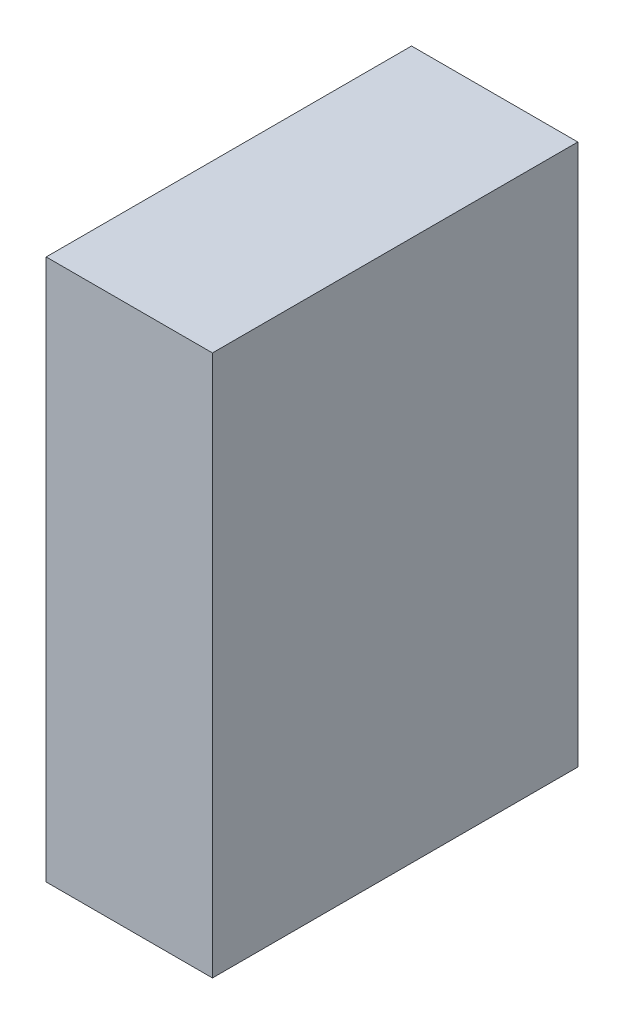
ISO-10303-21;
HEADER;
FILE_DESCRIPTION(('STEP AP214'),'2;1');
FILE_NAME('part.step','',(''),(''),'','','');
FILE_SCHEMA(('AUTOMOTIVE_DESIGN { 1 0 10303 214 1 1 1 1 }'));
ENDSEC;
DATA;
#1=APPLICATION_CONTEXT('core data for automotive mechanical design processes');
#2=APPLICATION_PROTOCOL_DEFINITION('international standard','automotive_design',2000,#1);
#3=PRODUCT_CONTEXT('',#1,'mechanical');
#4=PRODUCT('Part','Part','',(#3));
#5=PRODUCT_RELATED_PRODUCT_CATEGORY('part','',(#4));
#6=PRODUCT_DEFINITION_FORMATION('','',#4);
#7=PRODUCT_DEFINITION_CONTEXT('part definition',#1,'design');
#8=PRODUCT_DEFINITION('design','',#6,#7);
#9=PRODUCT_DEFINITION_SHAPE('','',#8);
#10=(LENGTH_UNIT() NAMED_UNIT(*) SI_UNIT(.MILLI.,.METRE.));
#11=(NAMED_UNIT(*) PLANE_ANGLE_UNIT() SI_UNIT($,.RADIAN.));
#12=(NAMED_UNIT(*) SI_UNIT($,.STERADIAN.) SOLID_ANGLE_UNIT());
#13=UNCERTAINTY_MEASURE_WITH_UNIT(LENGTH_MEASURE(1.E-05),#10,'distance_accuracy_value','');
#14=(GEOMETRIC_REPRESENTATION_CONTEXT(3) GLOBAL_UNCERTAINTY_ASSIGNED_CONTEXT((#13)) GLOBAL_UNIT_ASSIGNED_CONTEXT((#10,
#11,#12)) REPRESENTATION_CONTEXT('',''));
#15=CARTESIAN_POINT('',(0.,0.,0.));
#16=DIRECTION('',(0.,0.,1.));
#17=DIRECTION('',(1.,0.,0.));
#18=AXIS2_PLACEMENT_3D('',#15,#16,#17);
#19=CARTESIAN_POINT('',(2.7305,-8.89,0.));
#20=DIRECTION('',(-1.,0.,0.));
#21=DIRECTION('',(0.,0.,1.));
#22=AXIS2_PLACEMENT_3D('',#19,#20,#21);
#23=PLANE('',#22);
#24=DIRECTION('',(0.,0.,-1.));
#25=VECTOR('',#24,1.);
#26=CARTESIAN_POINT('',(2.7305,8.89,0.));
#27=LINE('',#26,#25);
#28=CARTESIAN_POINT('',(2.7305,8.89,0.));
#29=VERTEX_POINT('',#28);
#30=CARTESIAN_POINT('',(2.7305,8.89,11.99999886));
#31=VERTEX_POINT('',#30);
#32=EDGE_CURVE('E20',#29,#31,#27,.F.);
#33=ORIENTED_EDGE('',*,*,#32,.T.);
#34=DIRECTION('',(0.,1.,0.));
#35=VECTOR('',#34,1.);
#36=CARTESIAN_POINT('',(2.7305,8.89,11.99999886));
#37=LINE('',#36,#35);
#38=CARTESIAN_POINT('',(2.7305,-8.89,11.99999886));
#39=VERTEX_POINT('',#38);
#40=EDGE_CURVE('E55',#31,#39,#37,.F.);
#41=ORIENTED_EDGE('',*,*,#40,.T.);
#42=DIRECTION('',(0.,0.,1.));
#43=VECTOR('',#42,1.);
#44=CARTESIAN_POINT('',(2.7305,-8.89,0.));
#45=LINE('',#44,#43);
#46=CARTESIAN_POINT('',(2.7305,-8.89,0.));
#47=VERTEX_POINT('',#46);
#48=EDGE_CURVE('E74',#39,#47,#45,.F.);
#49=ORIENTED_EDGE('',*,*,#48,.T.);
#50=DIRECTION('',(0.,1.,0.));
#51=VECTOR('',#50,1.);
#52=CARTESIAN_POINT('',(2.7305,8.89,0.));
#53=LINE('',#52,#51);
#54=EDGE_CURVE('E66',#29,#47,#53,.F.);
#55=ORIENTED_EDGE('',*,*,#54,.F.);
#56=EDGE_LOOP('',(#33,#41,#49,#55));
#57=FACE_BOUND('',#56,.T.);
#58=ADVANCED_FACE('F17',(#57),#23,.F.);
#59=CARTESIAN_POINT('',(2.7305,8.89,0.));
#60=DIRECTION('',(0.,-1.,0.));
#61=DIRECTION('',(0.,0.,-1.));
#62=AXIS2_PLACEMENT_3D('',#59,#60,#61);
#63=PLANE('',#62);
#64=DIRECTION('',(0.,0.,-1.));
#65=VECTOR('',#64,1.);
#66=CARTESIAN_POINT('',(-2.7305,8.89,0.));
#67=LINE('',#66,#65);
#68=CARTESIAN_POINT('',(-2.7305,8.89,0.));
#69=VERTEX_POINT('',#68);
#70=CARTESIAN_POINT('',(-2.7305,8.89,11.99999886));
#71=VERTEX_POINT('',#70);
#72=EDGE_CURVE('E72',#69,#71,#67,.F.);
#73=ORIENTED_EDGE('',*,*,#72,.T.);
#74=DIRECTION('',(-1.,0.,0.));
#75=VECTOR('',#74,1.);
#76=CARTESIAN_POINT('',(2.7305,8.89,11.99999886));
#77=LINE('',#76,#75);
#78=EDGE_CURVE('E62',#71,#31,#77,.F.);
#79=ORIENTED_EDGE('',*,*,#78,.T.);
#80=ORIENTED_EDGE('',*,*,#32,.F.);
#81=DIRECTION('',(-1.,0.,0.));
#82=VECTOR('',#81,1.);
#83=CARTESIAN_POINT('',(2.7305,8.89,0.));
#84=LINE('',#83,#82);
#85=EDGE_CURVE('E80',#69,#29,#84,.F.);
#86=ORIENTED_EDGE('',*,*,#85,.F.);
#87=EDGE_LOOP('',(#73,#79,#80,#86));
#88=FACE_BOUND('',#87,.T.);
#89=ADVANCED_FACE('F71',(#88),#63,.F.);
#90=CARTESIAN_POINT('',(2.7305,8.89,11.99999886));
#91=DIRECTION('',(0.,0.,-1.));
#92=DIRECTION('',(-1.,0.,0.));
#93=AXIS2_PLACEMENT_3D('',#90,#91,#92);
#94=PLANE('',#93);
#95=DIRECTION('',(0.,1.,0.));
#96=VECTOR('',#95,1.);
#97=CARTESIAN_POINT('',(-2.7305,8.89,11.99999886));
#98=LINE('',#97,#96);
#99=CARTESIAN_POINT('',(-2.7305,-8.89,11.99999886));
#100=VERTEX_POINT('',#99);
#101=EDGE_CURVE('E83',#71,#100,#98,.F.);
#102=ORIENTED_EDGE('',*,*,#101,.T.);
#103=DIRECTION('',(1.,0.,0.));
#104=VECTOR('',#103,1.);
#105=CARTESIAN_POINT('',(-2.7305,-8.89,11.99999886));
#106=LINE('',#105,#104);
#107=EDGE_CURVE('E64',#100,#39,#106,.T.);
#108=ORIENTED_EDGE('',*,*,#107,.T.);
#109=ORIENTED_EDGE('',*,*,#40,.F.);
#110=ORIENTED_EDGE('',*,*,#78,.F.);
#111=EDGE_LOOP('',(#102,#108,#109,#110));
#112=FACE_BOUND('',#111,.T.);
#113=ADVANCED_FACE('F60',(#112),#94,.F.);
#114=CARTESIAN_POINT('',(-2.7305,-8.89,0.));
#115=DIRECTION('',(0.,1.,0.));
#116=DIRECTION('',(0.,0.,1.));
#117=AXIS2_PLACEMENT_3D('',#114,#115,#116);
#118=PLANE('',#117);
#119=ORIENTED_EDGE('',*,*,#48,.F.);
#120=ORIENTED_EDGE('',*,*,#107,.F.);
#121=DIRECTION('',(0.,0.,-1.));
#122=VECTOR('',#121,1.);
#123=CARTESIAN_POINT('',(-2.7305,-8.89,0.));
#124=LINE('',#123,#122);
#125=CARTESIAN_POINT('',(-2.7305,-8.89,0.));
#126=VERTEX_POINT('',#125);
#127=EDGE_CURVE('E26',#100,#126,#124,.T.);
#128=ORIENTED_EDGE('',*,*,#127,.T.);
#129=DIRECTION('',(-1.,0.,0.));
#130=VECTOR('',#129,1.);
#131=CARTESIAN_POINT('',(2.7305,-8.89,0.));
#132=LINE('',#131,#130);
#133=EDGE_CURVE('E34',#47,#126,#132,.T.);
#134=ORIENTED_EDGE('',*,*,#133,.F.);
#135=EDGE_LOOP('',(#119,#120,#128,#134));
#136=FACE_BOUND('',#135,.T.);
#137=ADVANCED_FACE('F88',(#136),#118,.F.);
#138=CARTESIAN_POINT('',(2.7305,8.89,0.));
#139=DIRECTION('',(0.,0.,-1.));
#140=DIRECTION('',(-1.,0.,0.));
#141=AXIS2_PLACEMENT_3D('',#138,#139,#140);
#142=PLANE('',#141);
#143=DIRECTION('',(0.,1.,0.));
#144=VECTOR('',#143,1.);
#145=CARTESIAN_POINT('',(-2.7305,8.89,0.));
#146=LINE('',#145,#144);
#147=EDGE_CURVE('E11',#126,#69,#146,.T.);
#148=ORIENTED_EDGE('',*,*,#147,.T.);
#149=ORIENTED_EDGE('',*,*,#85,.T.);
#150=ORIENTED_EDGE('',*,*,#54,.T.);
#151=ORIENTED_EDGE('',*,*,#133,.T.);
#152=EDGE_LOOP('',(#148,#149,#150,#151));
#153=FACE_BOUND('',#152,.T.);
#154=ADVANCED_FACE('F91',(#153),#142,.T.);
#155=CARTESIAN_POINT('',(-2.7305,8.89,0.));
#156=DIRECTION('',(1.,0.,0.));
#157=DIRECTION('',(0.,0.,-1.));
#158=AXIS2_PLACEMENT_3D('',#155,#156,#157);
#159=PLANE('',#158);
#160=ORIENTED_EDGE('',*,*,#127,.F.);
#161=ORIENTED_EDGE('',*,*,#101,.F.);
#162=ORIENTED_EDGE('',*,*,#72,.F.);
#163=ORIENTED_EDGE('',*,*,#147,.F.);
#164=EDGE_LOOP('',(#160,#161,#162,#163));
#165=FACE_BOUND('',#164,.T.);
#166=ADVANCED_FACE('F90',(#165),#159,.F.);
#167=CLOSED_SHELL('',(#58,#89,#113,#137,#154,#166));
#168=MANIFOLD_SOLID_BREP('B1',#167);
#169=ADVANCED_BREP_SHAPE_REPRESENTATION('',(#18,#168),#14);
#170=SHAPE_DEFINITION_REPRESENTATION(#9,#169);
ENDSEC;
END-ISO-10303-21;
